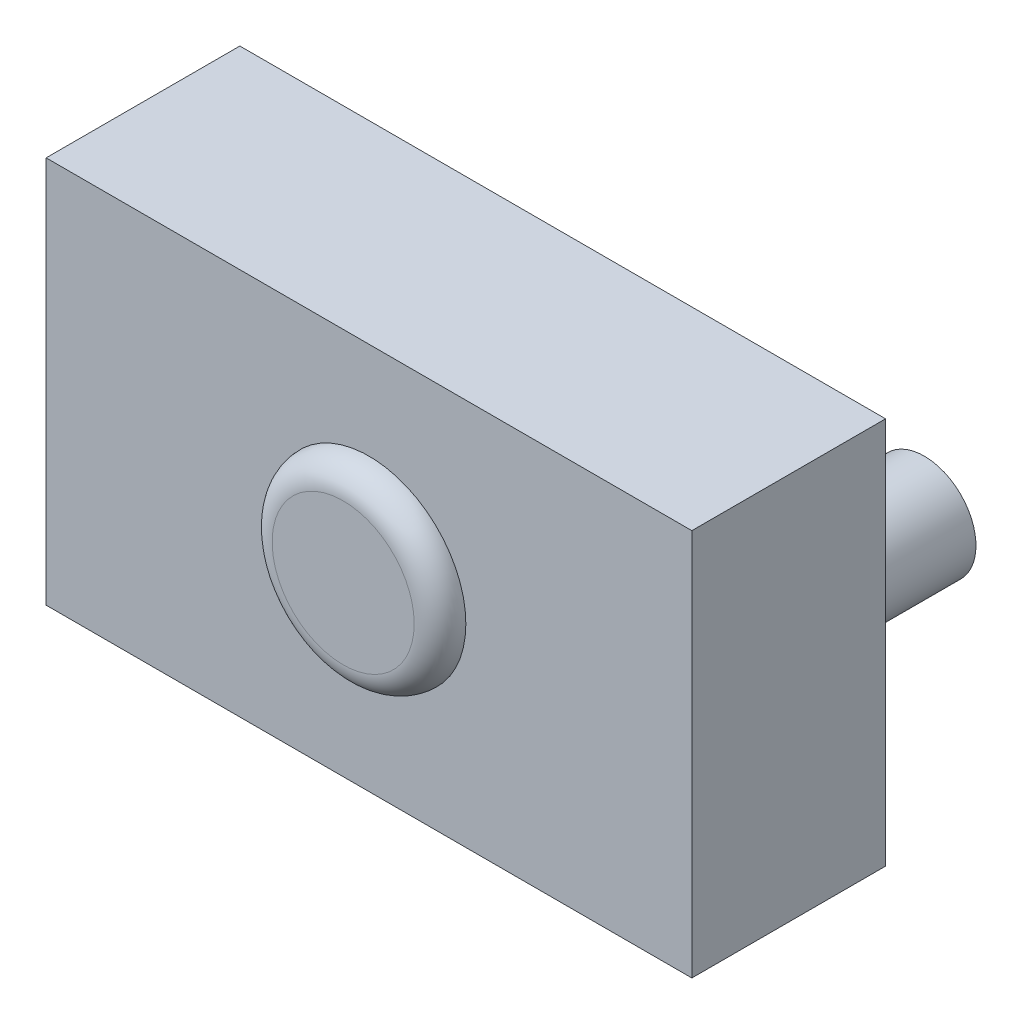
ISO-10303-21;
HEADER;
FILE_DESCRIPTION(('STEP AP214'),'2;1');
FILE_NAME('part.step','',(''),(''),'','','');
FILE_SCHEMA(('AUTOMOTIVE_DESIGN { 1 0 10303 214 1 1 1 1 }'));
ENDSEC;
DATA;
#1=APPLICATION_CONTEXT('core data for automotive mechanical design processes');
#2=APPLICATION_PROTOCOL_DEFINITION('international standard','automotive_design',2000,#1);
#3=PRODUCT_CONTEXT('',#1,'mechanical');
#4=PRODUCT('Part','Part','',(#3));
#5=PRODUCT_RELATED_PRODUCT_CATEGORY('part','',(#4));
#6=PRODUCT_DEFINITION_FORMATION('','',#4);
#7=PRODUCT_DEFINITION_CONTEXT('part definition',#1,'design');
#8=PRODUCT_DEFINITION('design','',#6,#7);
#9=PRODUCT_DEFINITION_SHAPE('','',#8);
#10=(LENGTH_UNIT() NAMED_UNIT(*) SI_UNIT(.MILLI.,.METRE.));
#11=(NAMED_UNIT(*) PLANE_ANGLE_UNIT() SI_UNIT($,.RADIAN.));
#12=(NAMED_UNIT(*) SI_UNIT($,.STERADIAN.) SOLID_ANGLE_UNIT());
#13=UNCERTAINTY_MEASURE_WITH_UNIT(LENGTH_MEASURE(1.E-05),#10,'distance_accuracy_value','');
#14=(GEOMETRIC_REPRESENTATION_CONTEXT(3) GLOBAL_UNCERTAINTY_ASSIGNED_CONTEXT((#13)) GLOBAL_UNIT_ASSIGNED_CONTEXT((#10,
#11,#12)) REPRESENTATION_CONTEXT('',''));
#15=CARTESIAN_POINT('',(0.,0.,0.));
#16=DIRECTION('',(0.,0.,1.));
#17=DIRECTION('',(1.,0.,0.));
#18=AXIS2_PLACEMENT_3D('',#15,#16,#17);
#19=CARTESIAN_POINT('',(25.,-15.,15.));
#20=DIRECTION('',(-1.,0.,0.));
#21=DIRECTION('',(0.,0.,1.));
#22=AXIS2_PLACEMENT_3D('',#19,#20,#21);
#23=PLANE('',#22);
#24=DIRECTION('',(0.,1.,0.));
#25=VECTOR('',#24,1.);
#26=CARTESIAN_POINT('',(25.,-15.,0.));
#27=LINE('',#26,#25);
#28=CARTESIAN_POINT('',(25.,-15.,0.));
#29=VERTEX_POINT('',#28);
#30=CARTESIAN_POINT('',(25.,15.,0.));
#31=VERTEX_POINT('',#30);
#32=EDGE_CURVE('E102',#29,#31,#27,.T.);
#33=ORIENTED_EDGE('',*,*,#32,.T.);
#34=DIRECTION('',(0.,0.,-1.));
#35=VECTOR('',#34,1.);
#36=CARTESIAN_POINT('',(25.,15.,15.));
#37=LINE('',#36,#35);
#38=CARTESIAN_POINT('',(25.,15.,15.));
#39=VERTEX_POINT('',#38);
#40=EDGE_CURVE('E93',#39,#31,#37,.T.);
#41=ORIENTED_EDGE('',*,*,#40,.F.);
#42=DIRECTION('',(0.,1.,0.));
#43=VECTOR('',#42,1.);
#44=CARTESIAN_POINT('',(25.,-15.,15.));
#45=LINE('',#44,#43);
#46=CARTESIAN_POINT('',(25.,-15.,15.));
#47=VERTEX_POINT('',#46);
#48=EDGE_CURVE('E87',#47,#39,#45,.T.);
#49=ORIENTED_EDGE('',*,*,#48,.F.);
#50=DIRECTION('',(0.,0.,-1.));
#51=VECTOR('',#50,1.);
#52=CARTESIAN_POINT('',(25.,-15.,15.));
#53=LINE('',#52,#51);
#54=EDGE_CURVE('E98',#47,#29,#53,.T.);
#55=ORIENTED_EDGE('',*,*,#54,.T.);
#56=EDGE_LOOP('',(#33,#41,#49,#55));
#57=FACE_BOUND('',#56,.T.);
#58=ADVANCED_FACE('F34',(#57),#23,.F.);
#59=CARTESIAN_POINT('',(-25.,15.,15.));
#60=DIRECTION('',(0.,-1.,0.));
#61=DIRECTION('',(0.,0.,-1.));
#62=AXIS2_PLACEMENT_3D('',#59,#60,#61);
#63=PLANE('',#62);
#64=DIRECTION('',(-1.,0.,0.));
#65=VECTOR('',#64,1.);
#66=CARTESIAN_POINT('',(-25.,15.,0.));
#67=LINE('',#66,#65);
#68=CARTESIAN_POINT('',(-25.,15.,0.));
#69=VERTEX_POINT('',#68);
#70=EDGE_CURVE('E92',#31,#69,#67,.T.);
#71=ORIENTED_EDGE('',*,*,#70,.T.);
#72=DIRECTION('',(0.,0.,-1.));
#73=VECTOR('',#72,1.);
#74=CARTESIAN_POINT('',(-25.,15.,15.));
#75=LINE('',#74,#73);
#76=CARTESIAN_POINT('',(-25.,15.,15.));
#77=VERTEX_POINT('',#76);
#78=EDGE_CURVE('E90',#77,#69,#75,.T.);
#79=ORIENTED_EDGE('',*,*,#78,.F.);
#80=DIRECTION('',(-1.,0.,0.));
#81=VECTOR('',#80,1.);
#82=CARTESIAN_POINT('',(-25.,15.,15.));
#83=LINE('',#82,#81);
#84=EDGE_CURVE('E82',#39,#77,#83,.T.);
#85=ORIENTED_EDGE('',*,*,#84,.F.);
#86=ORIENTED_EDGE('',*,*,#40,.T.);
#87=EDGE_LOOP('',(#71,#79,#85,#86));
#88=FACE_BOUND('',#87,.T.);
#89=ADVANCED_FACE('F91',(#88),#63,.F.);
#90=CARTESIAN_POINT('',(-25.,-15.,15.));
#91=DIRECTION('',(1.,0.,0.));
#92=DIRECTION('',(0.,0.,-1.));
#93=AXIS2_PLACEMENT_3D('',#90,#91,#92);
#94=PLANE('',#93);
#95=DIRECTION('',(0.,-1.,0.));
#96=VECTOR('',#95,1.);
#97=CARTESIAN_POINT('',(-25.,-15.,0.));
#98=LINE('',#97,#96);
#99=CARTESIAN_POINT('',(-25.,-15.,0.));
#100=VERTEX_POINT('',#99);
#101=EDGE_CURVE('E68',#69,#100,#98,.T.);
#102=ORIENTED_EDGE('',*,*,#101,.T.);
#103=DIRECTION('',(0.,0.,-1.));
#104=VECTOR('',#103,1.);
#105=CARTESIAN_POINT('',(-25.,-15.,15.));
#106=LINE('',#105,#104);
#107=CARTESIAN_POINT('',(-25.,-15.,15.));
#108=VERTEX_POINT('',#107);
#109=EDGE_CURVE('E94',#108,#100,#106,.T.);
#110=ORIENTED_EDGE('',*,*,#109,.F.);
#111=DIRECTION('',(0.,-1.,0.));
#112=VECTOR('',#111,1.);
#113=CARTESIAN_POINT('',(-25.,-15.,15.));
#114=LINE('',#113,#112);
#115=EDGE_CURVE('E85',#77,#108,#114,.T.);
#116=ORIENTED_EDGE('',*,*,#115,.F.);
#117=ORIENTED_EDGE('',*,*,#78,.T.);
#118=EDGE_LOOP('',(#102,#110,#116,#117));
#119=FACE_BOUND('',#118,.T.);
#120=ADVANCED_FACE('F96',(#119),#94,.F.);
#121=CARTESIAN_POINT('',(-25.,-15.,15.));
#122=DIRECTION('',(0.,1.,0.));
#123=DIRECTION('',(0.,0.,1.));
#124=AXIS2_PLACEMENT_3D('',#121,#122,#123);
#125=PLANE('',#124);
#126=DIRECTION('',(1.,0.,0.));
#127=VECTOR('',#126,1.);
#128=CARTESIAN_POINT('',(-25.,-15.,0.));
#129=LINE('',#128,#127);
#130=EDGE_CURVE('E74',#100,#29,#129,.T.);
#131=ORIENTED_EDGE('',*,*,#130,.T.);
#132=ORIENTED_EDGE('',*,*,#54,.F.);
#133=DIRECTION('',(1.,0.,0.));
#134=VECTOR('',#133,1.);
#135=CARTESIAN_POINT('',(-25.,-15.,15.));
#136=LINE('',#135,#134);
#137=EDGE_CURVE('E51',#108,#47,#136,.T.);
#138=ORIENTED_EDGE('',*,*,#137,.F.);
#139=ORIENTED_EDGE('',*,*,#109,.T.);
#140=EDGE_LOOP('',(#131,#132,#138,#139));
#141=FACE_BOUND('',#140,.T.);
#142=ADVANCED_FACE('F136',(#141),#125,.F.);
#143=CARTESIAN_POINT('',(0.,0.,15.));
#144=DIRECTION('',(0.,0.,-1.));
#145=DIRECTION('',(-1.,0.,0.));
#146=AXIS2_PLACEMENT_3D('',#143,#144,#145);
#147=PLANE('',#146);
#148=CARTESIAN_POINT('',(0.,0.,15.));
#149=DIRECTION('',(0.,0.,1.));
#150=DIRECTION('',(1.,0.,0.));
#151=AXIS2_PLACEMENT_3D('',#148,#149,#150);
#152=CIRCLE('',#151,7.5);
#153=CARTESIAN_POINT('',(7.5,0.,15.));
#154=VERTEX_POINT('',#153);
#155=EDGE_CURVE('E43',#154,#154,#152,.T.);
#156=ORIENTED_EDGE('',*,*,#155,.F.);
#157=EDGE_LOOP('',(#156));
#158=FACE_BOUND('',#157,.T.);
#159=ORIENTED_EDGE('',*,*,#48,.T.);
#160=ORIENTED_EDGE('',*,*,#84,.T.);
#161=ORIENTED_EDGE('',*,*,#115,.T.);
#162=ORIENTED_EDGE('',*,*,#137,.T.);
#163=EDGE_LOOP('',(#159,#160,#161,#162));
#164=FACE_BOUND('',#163,.T.);
#165=ADVANCED_FACE('F83',(#158,#164),#147,.F.);
#166=CARTESIAN_POINT('',(0.,0.,0.));
#167=DIRECTION('',(0.,0.,-1.));
#168=DIRECTION('',(-1.,0.,0.));
#169=AXIS2_PLACEMENT_3D('',#166,#167,#168);
#170=PLANE('',#169);
#171=CARTESIAN_POINT('',(-18.,0.,0.));
#172=DIRECTION('',(0.,0.,-1.));
#173=DIRECTION('',(-1.,0.,0.));
#174=AXIS2_PLACEMENT_3D('',#171,#172,#173);
#175=CIRCLE('',#174,4.);
#176=CARTESIAN_POINT('',(-22.,0.,0.));
#177=VERTEX_POINT('',#176);
#178=EDGE_CURVE('E119',#177,#177,#175,.T.);
#179=ORIENTED_EDGE('',*,*,#178,.F.);
#180=EDGE_LOOP('',(#179));
#181=FACE_BOUND('',#180,.T.);
#182=CARTESIAN_POINT('',(18.,0.,0.));
#183=DIRECTION('',(0.,0.,-1.));
#184=DIRECTION('',(-1.,0.,0.));
#185=AXIS2_PLACEMENT_3D('',#182,#183,#184);
#186=CIRCLE('',#185,4.);
#187=CARTESIAN_POINT('',(14.,0.,0.));
#188=VERTEX_POINT('',#187);
#189=EDGE_CURVE('E118',#188,#188,#186,.T.);
#190=ORIENTED_EDGE('',*,*,#189,.F.);
#191=EDGE_LOOP('',(#190));
#192=FACE_BOUND('',#191,.T.);
#193=ORIENTED_EDGE('',*,*,#32,.F.);
#194=ORIENTED_EDGE('',*,*,#130,.F.);
#195=ORIENTED_EDGE('',*,*,#101,.F.);
#196=ORIENTED_EDGE('',*,*,#70,.F.);
#197=EDGE_LOOP('',(#193,#194,#195,#196));
#198=FACE_BOUND('',#197,.T.);
#199=ADVANCED_FACE('F129',(#181,#192,#198),#170,.T.);
#200=CARTESIAN_POINT('',(18.,0.,-10.));
#201=DIRECTION('',(0.,0.,1.));
#202=DIRECTION('',(1.,0.,0.));
#203=AXIS2_PLACEMENT_3D('',#200,#201,#202);
#204=CYLINDRICAL_SURFACE('',#203,4.);
#205=CARTESIAN_POINT('',(18.,0.,-10.));
#206=DIRECTION('',(0.,0.,-1.));
#207=DIRECTION('',(-1.,0.,0.));
#208=AXIS2_PLACEMENT_3D('',#205,#206,#207);
#209=CIRCLE('',#208,4.);
#210=CARTESIAN_POINT('',(14.,0.,-10.));
#211=VERTEX_POINT('',#210);
#212=EDGE_CURVE('E105',#211,#211,#209,.T.);
#213=ORIENTED_EDGE('',*,*,#212,.F.);
#214=EDGE_LOOP('',(#213));
#215=FACE_BOUND('',#214,.T.);
#216=ORIENTED_EDGE('',*,*,#189,.T.);
#217=EDGE_LOOP('',(#216));
#218=FACE_BOUND('',#217,.T.);
#219=ADVANCED_FACE('F127',(#215,#218),#204,.T.);
#220=CARTESIAN_POINT('',(18.,0.,-10.));
#221=DIRECTION('',(0.,0.,-1.));
#222=DIRECTION('',(-1.,0.,0.));
#223=AXIS2_PLACEMENT_3D('',#220,#221,#222);
#224=PLANE('',#223);
#225=ORIENTED_EDGE('',*,*,#212,.T.);
#226=EDGE_LOOP('',(#225));
#227=FACE_BOUND('',#226,.T.);
#228=ADVANCED_FACE('F178',(#227),#224,.T.);
#229=CARTESIAN_POINT('',(-18.,0.,-10.));
#230=DIRECTION('',(0.,0.,1.));
#231=DIRECTION('',(1.,0.,0.));
#232=AXIS2_PLACEMENT_3D('',#229,#230,#231);
#233=CYLINDRICAL_SURFACE('',#232,4.);
#234=CARTESIAN_POINT('',(-18.,0.,-10.));
#235=DIRECTION('',(0.,0.,-1.));
#236=DIRECTION('',(-1.,0.,0.));
#237=AXIS2_PLACEMENT_3D('',#234,#235,#236);
#238=CIRCLE('',#237,4.);
#239=CARTESIAN_POINT('',(-22.,0.,-10.));
#240=VERTEX_POINT('',#239);
#241=EDGE_CURVE('E115',#240,#240,#238,.T.);
#242=ORIENTED_EDGE('',*,*,#241,.F.);
#243=EDGE_LOOP('',(#242));
#244=FACE_BOUND('',#243,.T.);
#245=ORIENTED_EDGE('',*,*,#178,.T.);
#246=EDGE_LOOP('',(#245));
#247=FACE_BOUND('',#246,.T.);
#248=ADVANCED_FACE('F188',(#244,#247),#233,.T.);
#249=CARTESIAN_POINT('',(-18.,0.,-10.));
#250=DIRECTION('',(0.,0.,-1.));
#251=DIRECTION('',(-1.,0.,0.));
#252=AXIS2_PLACEMENT_3D('',#249,#250,#251);
#253=PLANE('',#252);
#254=ORIENTED_EDGE('',*,*,#241,.T.);
#255=EDGE_LOOP('',(#254));
#256=FACE_BOUND('',#255,.T.);
#257=ADVANCED_FACE('F198',(#256),#253,.T.);
#258=CARTESIAN_POINT('',(0.,0.,17.));
#259=DIRECTION('',(0.,0.,1.));
#260=DIRECTION('',(1.,0.,0.));
#261=AXIS2_PLACEMENT_3D('',#258,#259,#260);
#262=PLANE('',#261);
#263=CARTESIAN_POINT('',(0.,0.,17.));
#264=DIRECTION('',(0.,0.,1.));
#265=DIRECTION('',(1.,0.,0.));
#266=AXIS2_PLACEMENT_3D('',#263,#264,#265);
#267=CIRCLE('',#266,5.5);
#268=CARTESIAN_POINT('',(5.5,0.,17.));
#269=VERTEX_POINT('',#268);
#270=EDGE_CURVE('E11',#269,#269,#267,.T.);
#271=ORIENTED_EDGE('',*,*,#270,.T.);
#272=EDGE_LOOP('',(#271));
#273=FACE_BOUND('',#272,.T.);
#274=ADVANCED_FACE('F208',(#273),#262,.T.);
#275=CARTESIAN_POINT('',(0.,0.,15.));
#276=DIRECTION('',(0.,0.,1.));
#277=DIRECTION('',(1.,0.,0.));
#278=AXIS2_PLACEMENT_3D('',#275,#276,#277);
#279=TOROIDAL_SURFACE('',#278,5.5,2.);
#280=ORIENTED_EDGE('',*,*,#155,.T.);
#281=EDGE_LOOP('',(#280));
#282=FACE_BOUND('',#281,.T.);
#283=ORIENTED_EDGE('',*,*,#270,.F.);
#284=EDGE_LOOP('',(#283));
#285=FACE_BOUND('',#284,.T.);
#286=ADVANCED_FACE('F36',(#282,#285),#279,.T.);
#287=CLOSED_SHELL('',(#58,#89,#120,#142,#165,#199,#219,#228,#248,#257,#274,#286));
#288=MANIFOLD_SOLID_BREP('B2',#287);
#289=ADVANCED_BREP_SHAPE_REPRESENTATION('',(#18,#288),#14);
#290=SHAPE_DEFINITION_REPRESENTATION(#9,#289);
ENDSEC;
END-ISO-10303-21;
